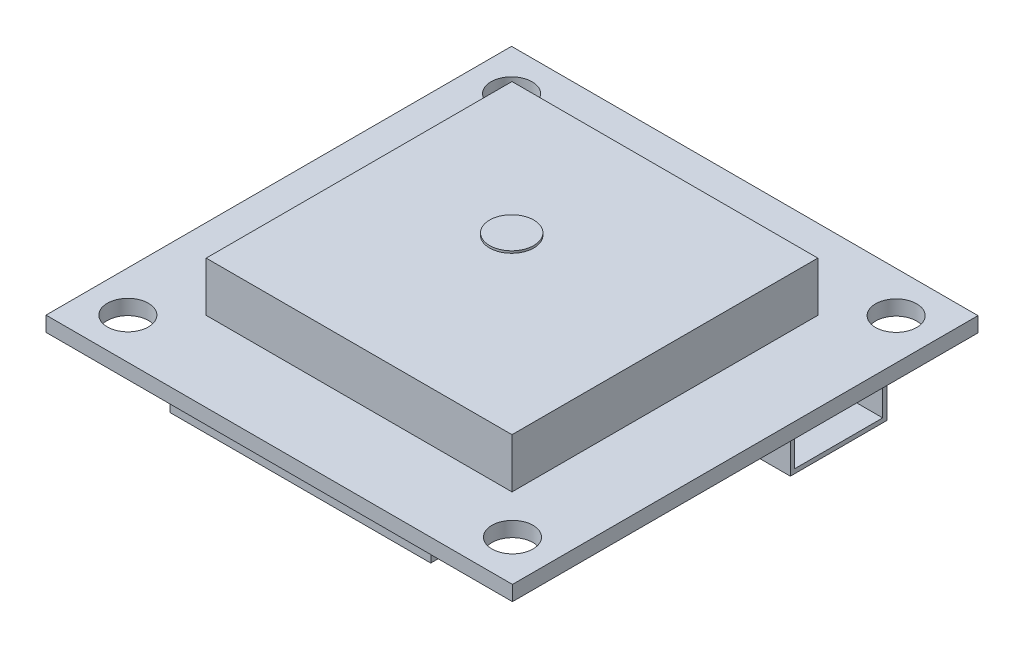
ISO-10303-21;
HEADER;
FILE_DESCRIPTION(('STEP AP214'),'2;1');
FILE_NAME('part.step','',(''),(''),'','','');
FILE_SCHEMA(('AUTOMOTIVE_DESIGN { 1 0 10303 214 1 1 1 1 }'));
ENDSEC;
DATA;
#1=APPLICATION_CONTEXT('core data for automotive mechanical design processes');
#2=APPLICATION_PROTOCOL_DEFINITION('international standard','automotive_design',2000,#1);
#3=PRODUCT_CONTEXT('',#1,'mechanical');
#4=PRODUCT('Part','Part','',(#3));
#5=PRODUCT_RELATED_PRODUCT_CATEGORY('part','',(#4));
#6=PRODUCT_DEFINITION_FORMATION('','',#4);
#7=PRODUCT_DEFINITION_CONTEXT('part definition',#1,'design');
#8=PRODUCT_DEFINITION('design','',#6,#7);
#9=PRODUCT_DEFINITION_SHAPE('','',#8);
#10=(LENGTH_UNIT() NAMED_UNIT(*) SI_UNIT(.MILLI.,.METRE.));
#11=(NAMED_UNIT(*) PLANE_ANGLE_UNIT() SI_UNIT($,.RADIAN.));
#12=(NAMED_UNIT(*) SI_UNIT($,.STERADIAN.) SOLID_ANGLE_UNIT());
#13=UNCERTAINTY_MEASURE_WITH_UNIT(LENGTH_MEASURE(1.E-05),#10,'distance_accuracy_value','');
#14=(GEOMETRIC_REPRESENTATION_CONTEXT(3) GLOBAL_UNCERTAINTY_ASSIGNED_CONTEXT((#13)) GLOBAL_UNIT_ASSIGNED_CONTEXT((#10,
#11,#12)) REPRESENTATION_CONTEXT('',''));
#15=CARTESIAN_POINT('',(0.,0.,0.));
#16=DIRECTION('',(0.,0.,1.));
#17=DIRECTION('',(1.,0.,0.));
#18=AXIS2_PLACEMENT_3D('',#15,#16,#17);
#19=CARTESIAN_POINT('',(0.,5.3086,0.));
#20=DIRECTION('',(0.,-1.,0.));
#21=DIRECTION('',(0.,0.,-1.));
#22=AXIS2_PLACEMENT_3D('',#19,#20,#21);
#23=PLANE('',#22);
#24=DIRECTION('',(0.,0.,-1.));
#25=VECTOR('',#24,1.);
#26=CARTESIAN_POINT('',(31.75,5.3086,-31.7119));
#27=LINE('',#26,#25);
#28=CARTESIAN_POINT('',(31.75,5.3086,-6.5659));
#29=VERTEX_POINT('',#28);
#30=CARTESIAN_POINT('',(31.75,5.3086,-31.7119));
#31=VERTEX_POINT('',#30);
#32=EDGE_CURVE('E275',#29,#31,#27,.T.);
#33=ORIENTED_EDGE('',*,*,#32,.T.);
#34=DIRECTION('',(-1.,0.,0.));
#35=VECTOR('',#34,1.);
#36=CARTESIAN_POINT('',(31.75,5.3086,-31.7119));
#37=LINE('',#36,#35);
#38=CARTESIAN_POINT('',(6.604,5.3086,-31.7119));
#39=VERTEX_POINT('',#38);
#40=EDGE_CURVE('E278',#31,#39,#37,.T.);
#41=ORIENTED_EDGE('',*,*,#40,.T.);
#42=DIRECTION('',(0.,0.,1.));
#43=VECTOR('',#42,1.);
#44=CARTESIAN_POINT('',(6.604,5.3086,-31.7119));
#45=LINE('',#44,#43);
#46=CARTESIAN_POINT('',(6.604,5.3086,-6.56589999999999));
#47=VERTEX_POINT('',#46);
#48=EDGE_CURVE('E281',#39,#47,#45,.T.);
#49=ORIENTED_EDGE('',*,*,#48,.T.);
#50=DIRECTION('',(1.,0.,0.));
#51=VECTOR('',#50,1.);
#52=CARTESIAN_POINT('',(31.75,5.3086,-6.5659));
#53=LINE('',#52,#51);
#54=EDGE_CURVE('E283',#47,#29,#53,.T.);
#55=ORIENTED_EDGE('',*,*,#54,.T.);
#56=EDGE_LOOP('',(#33,#41,#49,#55));
#57=FACE_BOUND('',#56,.T.);
#58=CARTESIAN_POINT('',(17.5387,5.3086,-20.7518));
#59=DIRECTION('',(0.,-1.,0.));
#60=DIRECTION('',(0.,0.,-1.));
#61=AXIS2_PLACEMENT_3D('',#58,#59,#60);
#62=CIRCLE('',#61,1.8161);
#63=CARTESIAN_POINT('',(17.5387,5.3086,-22.5679));
#64=VERTEX_POINT('',#63);
#65=EDGE_CURVE('E11',#64,#64,#62,.F.);
#66=ORIENTED_EDGE('',*,*,#65,.F.);
#67=EDGE_LOOP('',(#66));
#68=FACE_BOUND('',#67,.T.);
#69=ADVANCED_FACE('F32',(#57,#68),#23,.F.);
#70=CARTESIAN_POINT('',(0.,0.,0.));
#71=DIRECTION('',(0.,-1.,0.));
#72=DIRECTION('',(0.,0.,-1.));
#73=AXIS2_PLACEMENT_3D('',#70,#71,#72);
#74=PLANE('',#73);
#75=CARTESIAN_POINT('',(34.9885,0.,-34.9123));
#76=DIRECTION('',(0.,-1.,0.));
#77=DIRECTION('',(0.,0.,-1.));
#78=AXIS2_PLACEMENT_3D('',#75,#76,#77);
#79=CIRCLE('',#78,1.6891);
#80=CARTESIAN_POINT('',(34.9885,0.,-36.6014));
#81=VERTEX_POINT('',#80);
#82=EDGE_CURVE('E502',#81,#81,#79,.F.);
#83=ORIENTED_EDGE('',*,*,#82,.T.);
#84=EDGE_LOOP('',(#83));
#85=FACE_BOUND('',#84,.T.);
#86=CARTESIAN_POINT('',(3.36550000000002,0.,-34.9123));
#87=DIRECTION('',(0.,-1.,0.));
#88=DIRECTION('',(0.,0.,-1.));
#89=AXIS2_PLACEMENT_3D('',#86,#87,#88);
#90=CIRCLE('',#89,1.68909999999999);
#91=CARTESIAN_POINT('',(3.36550000000002,0.,-36.6014));
#92=VERTEX_POINT('',#91);
#93=EDGE_CURVE('E509',#92,#92,#90,.F.);
#94=ORIENTED_EDGE('',*,*,#93,.T.);
#95=EDGE_LOOP('',(#94));
#96=FACE_BOUND('',#95,.T.);
#97=CARTESIAN_POINT('',(3.36550000000002,0.,-3.3655));
#98=DIRECTION('',(0.,-1.,0.));
#99=DIRECTION('',(0.,0.,-1.));
#100=AXIS2_PLACEMENT_3D('',#97,#98,#99);
#101=CIRCLE('',#100,1.6891);
#102=CARTESIAN_POINT('',(3.36550000000002,0.,-5.0546));
#103=VERTEX_POINT('',#102);
#104=EDGE_CURVE('E514',#103,#103,#101,.F.);
#105=ORIENTED_EDGE('',*,*,#104,.T.);
#106=EDGE_LOOP('',(#105));
#107=FACE_BOUND('',#106,.T.);
#108=CARTESIAN_POINT('',(34.9885,0.,-3.3655));
#109=DIRECTION('',(0.,-1.,0.));
#110=DIRECTION('',(0.,0.,-1.));
#111=AXIS2_PLACEMENT_3D('',#108,#109,#110);
#112=CIRCLE('',#111,1.6891);
#113=CARTESIAN_POINT('',(34.9885,0.,-5.0546));
#114=VERTEX_POINT('',#113);
#115=EDGE_CURVE('E196',#114,#114,#112,.F.);
#116=ORIENTED_EDGE('',*,*,#115,.T.);
#117=EDGE_LOOP('',(#116));
#118=FACE_BOUND('',#117,.T.);
#119=CARTESIAN_POINT('',(22.2758,0.,-32.6263));
#120=DIRECTION('',(0.,-1.,0.));
#121=DIRECTION('',(0.,0.,-1.));
#122=AXIS2_PLACEMENT_3D('',#119,#120,#121);
#123=CIRCLE('',#122,3.3782);
#124=CARTESIAN_POINT('',(22.2758,0.,-36.0045));
#125=VERTEX_POINT('',#124);
#126=EDGE_CURVE('E239',#125,#125,#123,.T.);
#127=ORIENTED_EDGE('',*,*,#126,.F.);
#128=EDGE_LOOP('',(#127));
#129=FACE_BOUND('',#128,.T.);
#130=DIRECTION('',(0.,0.,1.));
#131=VECTOR('',#130,1.);
#132=CARTESIAN_POINT('',(0.,0.,0.));
#133=LINE('',#132,#131);
#134=CARTESIAN_POINT('',(0.,0.,-38.2778));
#135=VERTEX_POINT('',#134);
#136=CARTESIAN_POINT('',(0.,0.,0.));
#137=VERTEX_POINT('',#136);
#138=EDGE_CURVE('E307',#135,#137,#133,.T.);
#139=ORIENTED_EDGE('',*,*,#138,.F.);
#140=DIRECTION('',(-1.,0.,0.));
#141=VECTOR('',#140,1.);
#142=CARTESIAN_POINT('',(0.,0.,-38.2778));
#143=LINE('',#142,#141);
#144=CARTESIAN_POINT('',(38.354,0.,-38.2778));
#145=VERTEX_POINT('',#144);
#146=EDGE_CURVE('E312',#145,#135,#143,.T.);
#147=ORIENTED_EDGE('',*,*,#146,.F.);
#148=DIRECTION('',(0.,0.,-1.));
#149=VECTOR('',#148,1.);
#150=CARTESIAN_POINT('',(38.354,0.,0.));
#151=LINE('',#150,#149);
#152=CARTESIAN_POINT('',(38.354,0.,0.));
#153=VERTEX_POINT('',#152);
#154=EDGE_CURVE('E323',#153,#145,#151,.T.);
#155=ORIENTED_EDGE('',*,*,#154,.F.);
#156=DIRECTION('',(1.,0.,0.));
#157=VECTOR('',#156,1.);
#158=CARTESIAN_POINT('',(0.,0.,0.));
#159=LINE('',#158,#157);
#160=EDGE_CURVE('E321',#137,#153,#159,.T.);
#161=ORIENTED_EDGE('',*,*,#160,.F.);
#162=EDGE_LOOP('',(#139,#147,#155,#161));
#163=FACE_BOUND('',#162,.T.);
#164=DIRECTION('',(1.,0.,0.));
#165=VECTOR('',#164,1.);
#166=CARTESIAN_POINT('',(8.382,0.,-18.6055));
#167=LINE('',#166,#165);
#168=CARTESIAN_POINT('',(8.382,0.,-18.6055));
#169=VERTEX_POINT('',#168);
#170=CARTESIAN_POINT('',(29.8196,0.,-18.6055));
#171=VERTEX_POINT('',#170);
#172=EDGE_CURVE('E259',#169,#171,#167,.T.);
#173=ORIENTED_EDGE('',*,*,#172,.F.);
#174=DIRECTION('',(0.,0.,-1.));
#175=VECTOR('',#174,1.);
#176=CARTESIAN_POINT('',(8.382,0.,-1.81609999999999));
#177=LINE('',#176,#175);
#178=CARTESIAN_POINT('',(8.382,0.,-1.81609999999999));
#179=VERTEX_POINT('',#178);
#180=EDGE_CURVE('E243',#179,#169,#177,.T.);
#181=ORIENTED_EDGE('',*,*,#180,.F.);
#182=DIRECTION('',(-1.,0.,0.));
#183=VECTOR('',#182,1.);
#184=CARTESIAN_POINT('',(8.382,0.,-1.81609999999999));
#185=LINE('',#184,#183);
#186=CARTESIAN_POINT('',(29.8196,0.,-1.81609999999999));
#187=VERTEX_POINT('',#186);
#188=EDGE_CURVE('E250',#187,#179,#185,.T.);
#189=ORIENTED_EDGE('',*,*,#188,.F.);
#190=DIRECTION('',(0.,0.,1.));
#191=VECTOR('',#190,1.);
#192=CARTESIAN_POINT('',(29.8196,0.,-1.81609999999999));
#193=LINE('',#192,#191);
#194=EDGE_CURVE('E261',#171,#187,#193,.T.);
#195=ORIENTED_EDGE('',*,*,#194,.F.);
#196=EDGE_LOOP('',(#173,#181,#189,#195));
#197=FACE_BOUND('',#196,.T.);
#198=DIRECTION('',(1.,0.,0.));
#199=VECTOR('',#198,1.);
#200=CARTESIAN_POINT('',(33.528,0.,-31.3055));
#201=LINE('',#200,#199);
#202=CARTESIAN_POINT('',(33.528,0.,-31.3055));
#203=VERTEX_POINT('',#202);
#204=CARTESIAN_POINT('',(37.846,0.,-31.3055));
#205=VERTEX_POINT('',#204);
#206=EDGE_CURVE('E226',#203,#205,#201,.T.);
#207=ORIENTED_EDGE('',*,*,#206,.F.);
#208=DIRECTION('',(0.,0.,-1.));
#209=VECTOR('',#208,1.);
#210=CARTESIAN_POINT('',(33.528,0.,-23.3553));
#211=LINE('',#210,#209);
#212=CARTESIAN_POINT('',(33.528,0.,-23.3553));
#213=VERTEX_POINT('',#212);
#214=EDGE_CURVE('E209',#213,#203,#211,.T.);
#215=ORIENTED_EDGE('',*,*,#214,.F.);
#216=DIRECTION('',(-1.,0.,0.));
#217=VECTOR('',#216,1.);
#218=CARTESIAN_POINT('',(33.528,0.,-23.3553));
#219=LINE('',#218,#217);
#220=CARTESIAN_POINT('',(37.846,0.,-23.3553));
#221=VERTEX_POINT('',#220);
#222=EDGE_CURVE('E217',#221,#213,#219,.T.);
#223=ORIENTED_EDGE('',*,*,#222,.F.);
#224=DIRECTION('',(0.,0.,1.));
#225=VECTOR('',#224,1.);
#226=CARTESIAN_POINT('',(37.846,0.,-23.3553));
#227=LINE('',#226,#225);
#228=EDGE_CURVE('E228',#205,#221,#227,.T.);
#229=ORIENTED_EDGE('',*,*,#228,.F.);
#230=EDGE_LOOP('',(#207,#215,#223,#229));
#231=FACE_BOUND('',#230,.T.);
#232=ADVANCED_FACE('F344',(#85,#96,#107,#118,#129,#163,#197,#231),#74,.T.);
#233=CARTESIAN_POINT('',(0.,1.2319,0.));
#234=DIRECTION('',(0.,-1.,0.));
#235=DIRECTION('',(0.,0.,-1.));
#236=AXIS2_PLACEMENT_3D('',#233,#234,#235);
#237=PLANE('',#236);
#238=CARTESIAN_POINT('',(34.9885,1.2319,-34.9123));
#239=DIRECTION('',(0.,1.,0.));
#240=DIRECTION('',(0.,0.,1.));
#241=AXIS2_PLACEMENT_3D('',#238,#239,#240);
#242=CIRCLE('',#241,1.6891);
#243=CARTESIAN_POINT('',(34.9885,1.2319,-33.2232));
#244=VERTEX_POINT('',#243);
#245=EDGE_CURVE('E505',#244,#244,#242,.T.);
#246=ORIENTED_EDGE('',*,*,#245,.F.);
#247=EDGE_LOOP('',(#246));
#248=FACE_BOUND('',#247,.T.);
#249=CARTESIAN_POINT('',(3.36550000000002,1.2319,-34.9123));
#250=DIRECTION('',(0.,1.,0.));
#251=DIRECTION('',(0.,0.,1.));
#252=AXIS2_PLACEMENT_3D('',#249,#250,#251);
#253=CIRCLE('',#252,1.68909999999999);
#254=CARTESIAN_POINT('',(3.36550000000002,1.2319,-33.2232));
#255=VERTEX_POINT('',#254);
#256=EDGE_CURVE('E511',#255,#255,#253,.T.);
#257=ORIENTED_EDGE('',*,*,#256,.F.);
#258=EDGE_LOOP('',(#257));
#259=FACE_BOUND('',#258,.T.);
#260=CARTESIAN_POINT('',(3.36550000000002,1.2319,-3.3655));
#261=DIRECTION('',(0.,1.,0.));
#262=DIRECTION('',(0.,0.,1.));
#263=AXIS2_PLACEMENT_3D('',#260,#261,#262);
#264=CIRCLE('',#263,1.6891);
#265=CARTESIAN_POINT('',(3.36550000000002,1.2319,-1.6764));
#266=VERTEX_POINT('',#265);
#267=EDGE_CURVE('E517',#266,#266,#264,.T.);
#268=ORIENTED_EDGE('',*,*,#267,.F.);
#269=EDGE_LOOP('',(#268));
#270=FACE_BOUND('',#269,.T.);
#271=CARTESIAN_POINT('',(34.9885,1.2319,-3.3655));
#272=DIRECTION('',(0.,1.,0.));
#273=DIRECTION('',(0.,0.,1.));
#274=AXIS2_PLACEMENT_3D('',#271,#272,#273);
#275=CIRCLE('',#274,1.6891);
#276=CARTESIAN_POINT('',(34.9885,1.2319,-1.6764));
#277=VERTEX_POINT('',#276);
#278=EDGE_CURVE('E203',#277,#277,#275,.T.);
#279=ORIENTED_EDGE('',*,*,#278,.F.);
#280=EDGE_LOOP('',(#279));
#281=FACE_BOUND('',#280,.T.);
#282=DIRECTION('',(0.,0.,1.));
#283=VECTOR('',#282,1.);
#284=CARTESIAN_POINT('',(0.,1.2319,0.));
#285=LINE('',#284,#283);
#286=CARTESIAN_POINT('',(0.,1.2319,-38.2778));
#287=VERTEX_POINT('',#286);
#288=CARTESIAN_POINT('',(0.,1.2319,0.));
#289=VERTEX_POINT('',#288);
#290=EDGE_CURVE('E308',#287,#289,#285,.T.);
#291=ORIENTED_EDGE('',*,*,#290,.T.);
#292=DIRECTION('',(1.,0.,0.));
#293=VECTOR('',#292,1.);
#294=CARTESIAN_POINT('',(0.,1.2319,0.));
#295=LINE('',#294,#293);
#296=CARTESIAN_POINT('',(38.354,1.2319,0.));
#297=VERTEX_POINT('',#296);
#298=EDGE_CURVE('E311',#289,#297,#295,.T.);
#299=ORIENTED_EDGE('',*,*,#298,.T.);
#300=DIRECTION('',(0.,0.,-1.));
#301=VECTOR('',#300,1.);
#302=CARTESIAN_POINT('',(38.354,1.2319,0.));
#303=LINE('',#302,#301);
#304=CARTESIAN_POINT('',(38.354,1.2319,-38.2778));
#305=VERTEX_POINT('',#304);
#306=EDGE_CURVE('E314',#297,#305,#303,.T.);
#307=ORIENTED_EDGE('',*,*,#306,.T.);
#308=DIRECTION('',(-1.,0.,0.));
#309=VECTOR('',#308,1.);
#310=CARTESIAN_POINT('',(0.,1.2319,-38.2778));
#311=LINE('',#310,#309);
#312=EDGE_CURVE('E316',#305,#287,#311,.T.);
#313=ORIENTED_EDGE('',*,*,#312,.T.);
#314=EDGE_LOOP('',(#291,#299,#307,#313));
#315=FACE_BOUND('',#314,.T.);
#316=DIRECTION('',(0.,0.,-1.));
#317=VECTOR('',#316,1.);
#318=CARTESIAN_POINT('',(31.75,1.2319,-31.7119));
#319=LINE('',#318,#317);
#320=CARTESIAN_POINT('',(31.75,1.2319,-6.5659));
#321=VERTEX_POINT('',#320);
#322=CARTESIAN_POINT('',(31.75,1.2319,-31.7119));
#323=VERTEX_POINT('',#322);
#324=EDGE_CURVE('E274',#321,#323,#319,.T.);
#325=ORIENTED_EDGE('',*,*,#324,.F.);
#326=DIRECTION('',(1.,0.,0.));
#327=VECTOR('',#326,1.);
#328=CARTESIAN_POINT('',(31.75,1.2319,-6.5659));
#329=LINE('',#328,#327);
#330=CARTESIAN_POINT('',(6.604,1.2319,-6.56589999999999));
#331=VERTEX_POINT('',#330);
#332=EDGE_CURVE('E279',#331,#321,#329,.T.);
#333=ORIENTED_EDGE('',*,*,#332,.F.);
#334=DIRECTION('',(0.,0.,1.));
#335=VECTOR('',#334,1.);
#336=CARTESIAN_POINT('',(6.604,1.2319,-31.7119));
#337=LINE('',#336,#335);
#338=CARTESIAN_POINT('',(6.604,1.2319,-31.7119));
#339=VERTEX_POINT('',#338);
#340=EDGE_CURVE('E291',#339,#331,#337,.T.);
#341=ORIENTED_EDGE('',*,*,#340,.F.);
#342=DIRECTION('',(-1.,0.,0.));
#343=VECTOR('',#342,1.);
#344=CARTESIAN_POINT('',(31.75,1.2319,-31.7119));
#345=LINE('',#344,#343);
#346=EDGE_CURVE('E288',#323,#339,#345,.T.);
#347=ORIENTED_EDGE('',*,*,#346,.F.);
#348=EDGE_LOOP('',(#325,#333,#341,#347));
#349=FACE_BOUND('',#348,.T.);
#350=ADVANCED_FACE('F355',(#248,#259,#270,#281,#315,#349),#237,.F.);
#351=CARTESIAN_POINT('',(0.,1.2319,0.));
#352=DIRECTION('',(1.,0.,0.));
#353=DIRECTION('',(0.,0.,-1.));
#354=AXIS2_PLACEMENT_3D('',#351,#352,#353);
#355=PLANE('',#354);
#356=ORIENTED_EDGE('',*,*,#138,.T.);
#357=DIRECTION('',(0.,-1.,0.));
#358=VECTOR('',#357,1.);
#359=CARTESIAN_POINT('',(0.,1.2319,0.));
#360=LINE('',#359,#358);
#361=EDGE_CURVE('E40',#289,#137,#360,.T.);
#362=ORIENTED_EDGE('',*,*,#361,.F.);
#363=ORIENTED_EDGE('',*,*,#290,.F.);
#364=DIRECTION('',(0.,-1.,0.));
#365=VECTOR('',#364,1.);
#366=CARTESIAN_POINT('',(0.,1.2319,-38.2778));
#367=LINE('',#366,#365);
#368=EDGE_CURVE('E318',#287,#135,#367,.T.);
#369=ORIENTED_EDGE('',*,*,#368,.T.);
#370=EDGE_LOOP('',(#356,#362,#363,#369));
#371=FACE_BOUND('',#370,.T.);
#372=ADVANCED_FACE('F34',(#371),#355,.F.);
#373=CARTESIAN_POINT('',(0.,1.2319,0.));
#374=DIRECTION('',(0.,0.,-1.));
#375=DIRECTION('',(-1.,0.,0.));
#376=AXIS2_PLACEMENT_3D('',#373,#374,#375);
#377=PLANE('',#376);
#378=ORIENTED_EDGE('',*,*,#160,.T.);
#379=DIRECTION('',(0.,-1.,0.));
#380=VECTOR('',#379,1.);
#381=CARTESIAN_POINT('',(38.354,1.2319,0.));
#382=LINE('',#381,#380);
#383=EDGE_CURVE('E331',#297,#153,#382,.T.);
#384=ORIENTED_EDGE('',*,*,#383,.F.);
#385=ORIENTED_EDGE('',*,*,#298,.F.);
#386=ORIENTED_EDGE('',*,*,#361,.T.);
#387=EDGE_LOOP('',(#378,#384,#385,#386));
#388=FACE_BOUND('',#387,.T.);
#389=ADVANCED_FACE('F336',(#388),#377,.F.);
#390=CARTESIAN_POINT('',(38.354,1.2319,0.));
#391=DIRECTION('',(-1.,0.,0.));
#392=DIRECTION('',(0.,0.,1.));
#393=AXIS2_PLACEMENT_3D('',#390,#391,#392);
#394=PLANE('',#393);
#395=ORIENTED_EDGE('',*,*,#154,.T.);
#396=DIRECTION('',(0.,-1.,0.));
#397=VECTOR('',#396,1.);
#398=CARTESIAN_POINT('',(38.354,1.2319,-38.2778));
#399=LINE('',#398,#397);
#400=EDGE_CURVE('E328',#305,#145,#399,.T.);
#401=ORIENTED_EDGE('',*,*,#400,.F.);
#402=ORIENTED_EDGE('',*,*,#306,.F.);
#403=ORIENTED_EDGE('',*,*,#383,.T.);
#404=EDGE_LOOP('',(#395,#401,#402,#403));
#405=FACE_BOUND('',#404,.T.);
#406=ADVANCED_FACE('F349',(#405),#394,.F.);
#407=CARTESIAN_POINT('',(0.,1.2319,-38.2778));
#408=DIRECTION('',(0.,0.,1.));
#409=DIRECTION('',(1.,0.,0.));
#410=AXIS2_PLACEMENT_3D('',#407,#408,#409);
#411=PLANE('',#410);
#412=ORIENTED_EDGE('',*,*,#146,.T.);
#413=ORIENTED_EDGE('',*,*,#368,.F.);
#414=ORIENTED_EDGE('',*,*,#312,.F.);
#415=ORIENTED_EDGE('',*,*,#400,.T.);
#416=EDGE_LOOP('',(#412,#413,#414,#415));
#417=FACE_BOUND('',#416,.T.);
#418=ADVANCED_FACE('F353',(#417),#411,.F.);
#419=CARTESIAN_POINT('',(31.75,5.3086,-31.7119));
#420=DIRECTION('',(-1.,0.,0.));
#421=DIRECTION('',(0.,0.,1.));
#422=AXIS2_PLACEMENT_3D('',#419,#420,#421);
#423=PLANE('',#422);
#424=ORIENTED_EDGE('',*,*,#324,.T.);
#425=DIRECTION('',(0.,-1.,0.));
#426=VECTOR('',#425,1.);
#427=CARTESIAN_POINT('',(31.75,5.3086,-31.7119));
#428=LINE('',#427,#426);
#429=EDGE_CURVE('E304',#31,#323,#428,.T.);
#430=ORIENTED_EDGE('',*,*,#429,.F.);
#431=ORIENTED_EDGE('',*,*,#32,.F.);
#432=DIRECTION('',(0.,-1.,0.));
#433=VECTOR('',#432,1.);
#434=CARTESIAN_POINT('',(31.75,5.3086,-6.5659));
#435=LINE('',#434,#433);
#436=EDGE_CURVE('E285',#29,#321,#435,.T.);
#437=ORIENTED_EDGE('',*,*,#436,.T.);
#438=EDGE_LOOP('',(#424,#430,#431,#437));
#439=FACE_BOUND('',#438,.T.);
#440=ADVANCED_FACE('F368',(#439),#423,.F.);
#441=CARTESIAN_POINT('',(31.75,5.3086,-31.7119));
#442=DIRECTION('',(0.,0.,1.));
#443=DIRECTION('',(1.,0.,0.));
#444=AXIS2_PLACEMENT_3D('',#441,#442,#443);
#445=PLANE('',#444);
#446=ORIENTED_EDGE('',*,*,#346,.T.);
#447=DIRECTION('',(0.,-1.,0.));
#448=VECTOR('',#447,1.);
#449=CARTESIAN_POINT('',(6.604,5.3086,-31.7119));
#450=LINE('',#449,#448);
#451=EDGE_CURVE('E301',#39,#339,#450,.T.);
#452=ORIENTED_EDGE('',*,*,#451,.F.);
#453=ORIENTED_EDGE('',*,*,#40,.F.);
#454=ORIENTED_EDGE('',*,*,#429,.T.);
#455=EDGE_LOOP('',(#446,#452,#453,#454));
#456=FACE_BOUND('',#455,.T.);
#457=ADVANCED_FACE('F376',(#456),#445,.F.);
#458=CARTESIAN_POINT('',(6.604,5.3086,-31.7119));
#459=DIRECTION('',(1.,0.,0.));
#460=DIRECTION('',(0.,0.,-1.));
#461=AXIS2_PLACEMENT_3D('',#458,#459,#460);
#462=PLANE('',#461);
#463=ORIENTED_EDGE('',*,*,#340,.T.);
#464=DIRECTION('',(0.,-1.,0.));
#465=VECTOR('',#464,1.);
#466=CARTESIAN_POINT('',(6.604,5.3086,-6.56589999999999));
#467=LINE('',#466,#465);
#468=EDGE_CURVE('E298',#47,#331,#467,.T.);
#469=ORIENTED_EDGE('',*,*,#468,.F.);
#470=ORIENTED_EDGE('',*,*,#48,.F.);
#471=ORIENTED_EDGE('',*,*,#451,.T.);
#472=EDGE_LOOP('',(#463,#469,#470,#471));
#473=FACE_BOUND('',#472,.T.);
#474=ADVANCED_FACE('F374',(#473),#462,.F.);
#475=CARTESIAN_POINT('',(31.75,5.3086,-6.5659));
#476=DIRECTION('',(0.,0.,-1.));
#477=DIRECTION('',(-1.,0.,0.));
#478=AXIS2_PLACEMENT_3D('',#475,#476,#477);
#479=PLANE('',#478);
#480=ORIENTED_EDGE('',*,*,#332,.T.);
#481=ORIENTED_EDGE('',*,*,#436,.F.);
#482=ORIENTED_EDGE('',*,*,#54,.F.);
#483=ORIENTED_EDGE('',*,*,#468,.T.);
#484=EDGE_LOOP('',(#480,#481,#482,#483));
#485=FACE_BOUND('',#484,.T.);
#486=ADVANCED_FACE('F364',(#485),#479,.F.);
#487=CARTESIAN_POINT('',(8.382,-2.4257,-1.81609999999999));
#488=DIRECTION('',(1.,0.,0.));
#489=DIRECTION('',(0.,0.,-1.));
#490=AXIS2_PLACEMENT_3D('',#487,#488,#489);
#491=PLANE('',#490);
#492=ORIENTED_EDGE('',*,*,#180,.T.);
#493=DIRECTION('',(0.,1.,0.));
#494=VECTOR('',#493,1.);
#495=CARTESIAN_POINT('',(8.382,-2.4257,-18.6055));
#496=LINE('',#495,#494);
#497=CARTESIAN_POINT('',(8.382,-2.4257,-18.6055));
#498=VERTEX_POINT('',#497);
#499=EDGE_CURVE('E272',#498,#169,#496,.T.);
#500=ORIENTED_EDGE('',*,*,#499,.F.);
#501=DIRECTION('',(0.,0.,-1.));
#502=VECTOR('',#501,1.);
#503=CARTESIAN_POINT('',(8.382,-2.4257,-1.81609999999999));
#504=LINE('',#503,#502);
#505=CARTESIAN_POINT('',(8.382,-2.4257,-1.81609999999999));
#506=VERTEX_POINT('',#505);
#507=EDGE_CURVE('E246',#506,#498,#504,.T.);
#508=ORIENTED_EDGE('',*,*,#507,.F.);
#509=DIRECTION('',(0.,1.,0.));
#510=VECTOR('',#509,1.);
#511=CARTESIAN_POINT('',(8.382,-2.4257,-1.81609999999999));
#512=LINE('',#511,#510);
#513=EDGE_CURVE('E256',#506,#179,#512,.T.);
#514=ORIENTED_EDGE('',*,*,#513,.T.);
#515=EDGE_LOOP('',(#492,#500,#508,#514));
#516=FACE_BOUND('',#515,.T.);
#517=ADVANCED_FACE('F394',(#516),#491,.F.);
#518=CARTESIAN_POINT('',(8.382,-2.4257,-18.6055));
#519=DIRECTION('',(0.,0.,1.));
#520=DIRECTION('',(1.,0.,0.));
#521=AXIS2_PLACEMENT_3D('',#518,#519,#520);
#522=PLANE('',#521);
#523=ORIENTED_EDGE('',*,*,#172,.T.);
#524=DIRECTION('',(0.,1.,0.));
#525=VECTOR('',#524,1.);
#526=CARTESIAN_POINT('',(29.8196,-2.4257,-18.6055));
#527=LINE('',#526,#525);
#528=CARTESIAN_POINT('',(29.8196,-2.4257,-18.6055));
#529=VERTEX_POINT('',#528);
#530=EDGE_CURVE('E269',#529,#171,#527,.T.);
#531=ORIENTED_EDGE('',*,*,#530,.F.);
#532=DIRECTION('',(1.,0.,0.));
#533=VECTOR('',#532,1.);
#534=CARTESIAN_POINT('',(8.382,-2.4257,-18.6055));
#535=LINE('',#534,#533);
#536=EDGE_CURVE('E249',#498,#529,#535,.T.);
#537=ORIENTED_EDGE('',*,*,#536,.F.);
#538=ORIENTED_EDGE('',*,*,#499,.T.);
#539=EDGE_LOOP('',(#523,#531,#537,#538));
#540=FACE_BOUND('',#539,.T.);
#541=ADVANCED_FACE('F400',(#540),#522,.F.);
#542=CARTESIAN_POINT('',(29.8196,-2.4257,-1.81609999999999));
#543=DIRECTION('',(-1.,0.,0.));
#544=DIRECTION('',(0.,0.,1.));
#545=AXIS2_PLACEMENT_3D('',#542,#543,#544);
#546=PLANE('',#545);
#547=ORIENTED_EDGE('',*,*,#194,.T.);
#548=DIRECTION('',(0.,1.,0.));
#549=VECTOR('',#548,1.);
#550=CARTESIAN_POINT('',(29.8196,-2.4257,-1.81609999999999));
#551=LINE('',#550,#549);
#552=CARTESIAN_POINT('',(29.8196,-2.4257,-1.81609999999999));
#553=VERTEX_POINT('',#552);
#554=EDGE_CURVE('E267',#553,#187,#551,.T.);
#555=ORIENTED_EDGE('',*,*,#554,.F.);
#556=DIRECTION('',(0.,0.,1.));
#557=VECTOR('',#556,1.);
#558=CARTESIAN_POINT('',(29.8196,-2.4257,-1.81609999999999));
#559=LINE('',#558,#557);
#560=EDGE_CURVE('E252',#529,#553,#559,.T.);
#561=ORIENTED_EDGE('',*,*,#560,.F.);
#562=ORIENTED_EDGE('',*,*,#530,.T.);
#563=EDGE_LOOP('',(#547,#555,#561,#562));
#564=FACE_BOUND('',#563,.T.);
#565=ADVANCED_FACE('F405',(#564),#546,.F.);
#566=CARTESIAN_POINT('',(8.382,-2.4257,-1.81609999999999));
#567=DIRECTION('',(0.,0.,-1.));
#568=DIRECTION('',(-1.,0.,0.));
#569=AXIS2_PLACEMENT_3D('',#566,#567,#568);
#570=PLANE('',#569);
#571=ORIENTED_EDGE('',*,*,#188,.T.);
#572=ORIENTED_EDGE('',*,*,#513,.F.);
#573=DIRECTION('',(-1.,0.,0.));
#574=VECTOR('',#573,1.);
#575=CARTESIAN_POINT('',(8.382,-2.4257,-1.81609999999999));
#576=LINE('',#575,#574);
#577=EDGE_CURVE('E254',#553,#506,#576,.T.);
#578=ORIENTED_EDGE('',*,*,#577,.F.);
#579=ORIENTED_EDGE('',*,*,#554,.T.);
#580=EDGE_LOOP('',(#571,#572,#578,#579));
#581=FACE_BOUND('',#580,.T.);
#582=ADVANCED_FACE('F423',(#581),#570,.F.);
#583=CARTESIAN_POINT('',(0.,-2.4257,0.));
#584=DIRECTION('',(0.,-1.,0.));
#585=DIRECTION('',(0.,0.,-1.));
#586=AXIS2_PLACEMENT_3D('',#583,#584,#585);
#587=PLANE('',#586);
#588=ORIENTED_EDGE('',*,*,#507,.T.);
#589=ORIENTED_EDGE('',*,*,#536,.T.);
#590=ORIENTED_EDGE('',*,*,#560,.T.);
#591=ORIENTED_EDGE('',*,*,#577,.T.);
#592=EDGE_LOOP('',(#588,#589,#590,#591));
#593=FACE_BOUND('',#592,.T.);
#594=ADVANCED_FACE('F421',(#593),#587,.T.);
#595=CARTESIAN_POINT('',(22.2758,-2.1082,-32.6263));
#596=DIRECTION('',(0.,1.,0.));
#597=DIRECTION('',(0.,0.,1.));
#598=AXIS2_PLACEMENT_3D('',#595,#596,#597);
#599=CYLINDRICAL_SURFACE('',#598,3.3782);
#600=CARTESIAN_POINT('',(22.2758,-2.1082,-32.6263));
#601=DIRECTION('',(0.,-1.,0.));
#602=DIRECTION('',(0.,0.,-1.));
#603=AXIS2_PLACEMENT_3D('',#600,#601,#602);
#604=CIRCLE('',#603,3.3782);
#605=CARTESIAN_POINT('',(22.2758,-2.1082,-36.0045));
#606=VERTEX_POINT('',#605);
#607=EDGE_CURVE('E240',#606,#606,#604,.T.);
#608=ORIENTED_EDGE('',*,*,#607,.F.);
#609=EDGE_LOOP('',(#608));
#610=FACE_BOUND('',#609,.T.);
#611=ORIENTED_EDGE('',*,*,#126,.T.);
#612=EDGE_LOOP('',(#611));
#613=FACE_BOUND('',#612,.T.);
#614=ADVANCED_FACE('F430',(#610,#613),#599,.T.);
#615=CARTESIAN_POINT('',(22.2758,-2.1082,-32.6263));
#616=DIRECTION('',(0.,-1.,0.));
#617=DIRECTION('',(0.,0.,-1.));
#618=AXIS2_PLACEMENT_3D('',#615,#616,#617);
#619=PLANE('',#618);
#620=ORIENTED_EDGE('',*,*,#607,.T.);
#621=EDGE_LOOP('',(#620));
#622=FACE_BOUND('',#621,.T.);
#623=ADVANCED_FACE('F436',(#622),#619,.T.);
#624=CARTESIAN_POINT('',(33.528,-2.9972,-23.3553));
#625=DIRECTION('',(1.,0.,0.));
#626=DIRECTION('',(0.,0.,-1.));
#627=AXIS2_PLACEMENT_3D('',#624,#625,#626);
#628=PLANE('',#627);
#629=ORIENTED_EDGE('',*,*,#214,.T.);
#630=DIRECTION('',(0.,1.,0.));
#631=VECTOR('',#630,1.);
#632=CARTESIAN_POINT('',(33.528,-2.9972,-31.3055));
#633=LINE('',#632,#631);
#634=CARTESIAN_POINT('',(33.528,-2.9972,-31.3055));
#635=VERTEX_POINT('',#634);
#636=EDGE_CURVE('E237',#635,#203,#633,.T.);
#637=ORIENTED_EDGE('',*,*,#636,.F.);
#638=DIRECTION('',(0.,0.,-1.));
#639=VECTOR('',#638,1.);
#640=CARTESIAN_POINT('',(33.528,-2.9972,-23.3553));
#641=LINE('',#640,#639);
#642=CARTESIAN_POINT('',(33.528,-2.9972,-23.3553));
#643=VERTEX_POINT('',#642);
#644=EDGE_CURVE('E213',#643,#635,#641,.T.);
#645=ORIENTED_EDGE('',*,*,#644,.F.);
#646=DIRECTION('',(0.,1.,0.));
#647=VECTOR('',#646,1.);
#648=CARTESIAN_POINT('',(33.528,-2.9972,-23.3553));
#649=LINE('',#648,#647);
#650=EDGE_CURVE('E223',#643,#213,#649,.T.);
#651=ORIENTED_EDGE('',*,*,#650,.T.);
#652=EDGE_LOOP('',(#629,#637,#645,#651));
#653=FACE_BOUND('',#652,.T.);
#654=ADVANCED_FACE('F440',(#653),#628,.F.);
#655=CARTESIAN_POINT('',(33.528,-2.9972,-31.3055));
#656=DIRECTION('',(0.,0.,1.));
#657=DIRECTION('',(1.,0.,0.));
#658=AXIS2_PLACEMENT_3D('',#655,#656,#657);
#659=PLANE('',#658);
#660=ORIENTED_EDGE('',*,*,#206,.T.);
#661=DIRECTION('',(0.,1.,0.));
#662=VECTOR('',#661,1.);
#663=CARTESIAN_POINT('',(37.846,-2.9972,-31.3055));
#664=LINE('',#663,#662);
#665=CARTESIAN_POINT('',(37.846,-2.9972,-31.3055));
#666=VERTEX_POINT('',#665);
#667=EDGE_CURVE('E234',#666,#205,#664,.T.);
#668=ORIENTED_EDGE('',*,*,#667,.F.);
#669=DIRECTION('',(1.,0.,0.));
#670=VECTOR('',#669,1.);
#671=CARTESIAN_POINT('',(33.528,-2.9972,-31.3055));
#672=LINE('',#671,#670);
#673=EDGE_CURVE('E216',#635,#666,#672,.T.);
#674=ORIENTED_EDGE('',*,*,#673,.F.);
#675=ORIENTED_EDGE('',*,*,#636,.T.);
#676=EDGE_LOOP('',(#660,#668,#674,#675));
#677=FACE_BOUND('',#676,.T.);
#678=ADVANCED_FACE('F444',(#677),#659,.F.);
#679=CARTESIAN_POINT('',(37.846,-2.9972,-23.3553));
#680=DIRECTION('',(-1.,0.,0.));
#681=DIRECTION('',(0.,0.,1.));
#682=AXIS2_PLACEMENT_3D('',#679,#680,#681);
#683=PLANE('',#682);
#684=DIRECTION('',(0.,0.,-1.));
#685=VECTOR('',#684,1.);
#686=CARTESIAN_POINT('',(37.846,-2.6416,-23.7109));
#687=LINE('',#686,#685);
#688=CARTESIAN_POINT('',(37.846,-2.6416,-23.7109));
#689=VERTEX_POINT('',#688);
#690=CARTESIAN_POINT('',(37.846,-2.6416,-30.9499));
#691=VERTEX_POINT('',#690);
#692=EDGE_CURVE('E202',#689,#691,#687,.T.);
#693=ORIENTED_EDGE('',*,*,#692,.F.);
#694=DIRECTION('',(0.,-1.,0.));
#695=VECTOR('',#694,1.);
#696=CARTESIAN_POINT('',(37.846,-0.3556,-23.7109));
#697=LINE('',#696,#695);
#698=CARTESIAN_POINT('',(37.846,-0.3556,-23.7109));
#699=VERTEX_POINT('',#698);
#700=EDGE_CURVE('E47',#699,#689,#697,.T.);
#701=ORIENTED_EDGE('',*,*,#700,.F.);
#702=DIRECTION('',(0.,0.,1.));
#703=VECTOR('',#702,1.);
#704=CARTESIAN_POINT('',(37.846,-0.3556,-23.7109));
#705=LINE('',#704,#703);
#706=CARTESIAN_POINT('',(37.846,-0.3556,-30.9499));
#707=VERTEX_POINT('',#706);
#708=EDGE_CURVE('E190',#707,#699,#705,.T.);
#709=ORIENTED_EDGE('',*,*,#708,.F.);
#710=DIRECTION('',(0.,1.,0.));
#711=VECTOR('',#710,1.);
#712=CARTESIAN_POINT('',(37.846,-0.3556,-30.9499));
#713=LINE('',#712,#711);
#714=EDGE_CURVE('E193',#691,#707,#713,.T.);
#715=ORIENTED_EDGE('',*,*,#714,.F.);
#716=EDGE_LOOP('',(#693,#701,#709,#715));
#717=FACE_BOUND('',#716,.T.);
#718=ORIENTED_EDGE('',*,*,#228,.T.);
#719=DIRECTION('',(0.,1.,0.));
#720=VECTOR('',#719,1.);
#721=CARTESIAN_POINT('',(37.846,-2.9972,-23.3553));
#722=LINE('',#721,#720);
#723=CARTESIAN_POINT('',(37.846,-2.9972,-23.3553));
#724=VERTEX_POINT('',#723);
#725=EDGE_CURVE('E55',#724,#221,#722,.T.);
#726=ORIENTED_EDGE('',*,*,#725,.F.);
#727=DIRECTION('',(0.,0.,1.));
#728=VECTOR('',#727,1.);
#729=CARTESIAN_POINT('',(37.846,-2.9972,-23.3553));
#730=LINE('',#729,#728);
#731=EDGE_CURVE('E219',#666,#724,#730,.T.);
#732=ORIENTED_EDGE('',*,*,#731,.F.);
#733=ORIENTED_EDGE('',*,*,#667,.T.);
#734=EDGE_LOOP('',(#718,#726,#732,#733));
#735=FACE_BOUND('',#734,.T.);
#736=ADVANCED_FACE('F448',(#717,#735),#683,.F.);
#737=CARTESIAN_POINT('',(33.528,-2.9972,-23.3553));
#738=DIRECTION('',(0.,0.,-1.));
#739=DIRECTION('',(-1.,0.,0.));
#740=AXIS2_PLACEMENT_3D('',#737,#738,#739);
#741=PLANE('',#740);
#742=ORIENTED_EDGE('',*,*,#222,.T.);
#743=ORIENTED_EDGE('',*,*,#650,.F.);
#744=DIRECTION('',(-1.,0.,0.));
#745=VECTOR('',#744,1.);
#746=CARTESIAN_POINT('',(33.528,-2.9972,-23.3553));
#747=LINE('',#746,#745);
#748=EDGE_CURVE('E221',#724,#643,#747,.T.);
#749=ORIENTED_EDGE('',*,*,#748,.F.);
#750=ORIENTED_EDGE('',*,*,#725,.T.);
#751=EDGE_LOOP('',(#742,#743,#749,#750));
#752=FACE_BOUND('',#751,.T.);
#753=ADVANCED_FACE('F452',(#752),#741,.F.);
#754=CARTESIAN_POINT('',(0.,-2.9972,0.));
#755=DIRECTION('',(0.,-1.,0.));
#756=DIRECTION('',(0.,0.,-1.));
#757=AXIS2_PLACEMENT_3D('',#754,#755,#756);
#758=PLANE('',#757);
#759=ORIENTED_EDGE('',*,*,#644,.T.);
#760=ORIENTED_EDGE('',*,*,#673,.T.);
#761=ORIENTED_EDGE('',*,*,#731,.T.);
#762=ORIENTED_EDGE('',*,*,#748,.T.);
#763=EDGE_LOOP('',(#759,#760,#761,#762));
#764=FACE_BOUND('',#763,.T.);
#765=ADVANCED_FACE('F456',(#764),#758,.T.);
#766=CARTESIAN_POINT('',(34.0868,-0.3556,-23.7109));
#767=DIRECTION('',(0.,0.,1.));
#768=DIRECTION('',(1.,0.,0.));
#769=AXIS2_PLACEMENT_3D('',#766,#767,#768);
#770=PLANE('',#769);
#771=ORIENTED_EDGE('',*,*,#700,.T.);
#772=DIRECTION('',(1.,0.,0.));
#773=VECTOR('',#772,1.);
#774=CARTESIAN_POINT('',(34.0868,-2.6416,-23.7109));
#775=LINE('',#774,#773);
#776=CARTESIAN_POINT('',(34.0868,-2.6416,-23.7109));
#777=VERTEX_POINT('',#776);
#778=EDGE_CURVE('E168',#777,#689,#775,.T.);
#779=ORIENTED_EDGE('',*,*,#778,.F.);
#780=DIRECTION('',(0.,-1.,0.));
#781=VECTOR('',#780,1.);
#782=CARTESIAN_POINT('',(34.0868,-0.3556,-23.7109));
#783=LINE('',#782,#781);
#784=CARTESIAN_POINT('',(34.0868,-0.3556,-23.7109));
#785=VERTEX_POINT('',#784);
#786=EDGE_CURVE('E172',#785,#777,#783,.T.);
#787=ORIENTED_EDGE('',*,*,#786,.F.);
#788=DIRECTION('',(1.,0.,0.));
#789=VECTOR('',#788,1.);
#790=CARTESIAN_POINT('',(34.0868,-0.3556,-23.7109));
#791=LINE('',#790,#789);
#792=EDGE_CURVE('E207',#785,#699,#791,.T.);
#793=ORIENTED_EDGE('',*,*,#792,.T.);
#794=EDGE_LOOP('',(#771,#779,#787,#793));
#795=FACE_BOUND('',#794,.T.);
#796=ADVANCED_FACE('F170',(#795),#770,.F.);
#797=CARTESIAN_POINT('',(34.0868,-0.3556,-23.7109));
#798=DIRECTION('',(0.,1.,0.));
#799=DIRECTION('',(0.,0.,1.));
#800=AXIS2_PLACEMENT_3D('',#797,#798,#799);
#801=PLANE('',#800);
#802=ORIENTED_EDGE('',*,*,#708,.T.);
#803=ORIENTED_EDGE('',*,*,#792,.F.);
#804=DIRECTION('',(0.,0.,1.));
#805=VECTOR('',#804,1.);
#806=CARTESIAN_POINT('',(34.0868,-0.3556,-23.7109));
#807=LINE('',#806,#805);
#808=CARTESIAN_POINT('',(34.0868,-0.3556,-30.9499));
#809=VERTEX_POINT('',#808);
#810=EDGE_CURVE('E178',#809,#785,#807,.T.);
#811=ORIENTED_EDGE('',*,*,#810,.F.);
#812=DIRECTION('',(1.,0.,0.));
#813=VECTOR('',#812,1.);
#814=CARTESIAN_POINT('',(34.0868,-0.3556,-30.9499));
#815=LINE('',#814,#813);
#816=EDGE_CURVE('E210',#809,#707,#815,.T.);
#817=ORIENTED_EDGE('',*,*,#816,.T.);
#818=EDGE_LOOP('',(#802,#803,#811,#817));
#819=FACE_BOUND('',#818,.T.);
#820=ADVANCED_FACE('F462',(#819),#801,.F.);
#821=CARTESIAN_POINT('',(34.0868,-0.3556,-30.9499));
#822=DIRECTION('',(0.,0.,-1.));
#823=DIRECTION('',(-1.,0.,0.));
#824=AXIS2_PLACEMENT_3D('',#821,#822,#823);
#825=PLANE('',#824);
#826=ORIENTED_EDGE('',*,*,#714,.T.);
#827=ORIENTED_EDGE('',*,*,#816,.F.);
#828=DIRECTION('',(0.,1.,0.));
#829=VECTOR('',#828,1.);
#830=CARTESIAN_POINT('',(34.0868,-0.3556,-30.9499));
#831=LINE('',#830,#829);
#832=CARTESIAN_POINT('',(34.0868,-2.6416,-30.9499));
#833=VERTEX_POINT('',#832);
#834=EDGE_CURVE('E186',#833,#809,#831,.T.);
#835=ORIENTED_EDGE('',*,*,#834,.F.);
#836=DIRECTION('',(1.,0.,0.));
#837=VECTOR('',#836,1.);
#838=CARTESIAN_POINT('',(34.0868,-2.6416,-30.9499));
#839=LINE('',#838,#837);
#840=EDGE_CURVE('E177',#833,#691,#839,.T.);
#841=ORIENTED_EDGE('',*,*,#840,.T.);
#842=EDGE_LOOP('',(#826,#827,#835,#841));
#843=FACE_BOUND('',#842,.T.);
#844=ADVANCED_FACE('F465',(#843),#825,.F.);
#845=CARTESIAN_POINT('',(34.0868,-2.6416,-23.7109));
#846=DIRECTION('',(0.,-1.,0.));
#847=DIRECTION('',(0.,0.,-1.));
#848=AXIS2_PLACEMENT_3D('',#845,#846,#847);
#849=PLANE('',#848);
#850=ORIENTED_EDGE('',*,*,#692,.T.);
#851=ORIENTED_EDGE('',*,*,#840,.F.);
#852=DIRECTION('',(0.,0.,-1.));
#853=VECTOR('',#852,1.);
#854=CARTESIAN_POINT('',(34.0868,-2.6416,-23.7109));
#855=LINE('',#854,#853);
#856=EDGE_CURVE('E181',#777,#833,#855,.T.);
#857=ORIENTED_EDGE('',*,*,#856,.F.);
#858=ORIENTED_EDGE('',*,*,#778,.T.);
#859=EDGE_LOOP('',(#850,#851,#857,#858));
#860=FACE_BOUND('',#859,.T.);
#861=ADVANCED_FACE('F182',(#860),#849,.F.);
#862=CARTESIAN_POINT('',(34.0868,0.,0.));
#863=DIRECTION('',(1.,0.,0.));
#864=DIRECTION('',(0.,0.,-1.));
#865=AXIS2_PLACEMENT_3D('',#862,#863,#864);
#866=PLANE('',#865);
#867=ORIENTED_EDGE('',*,*,#786,.T.);
#868=ORIENTED_EDGE('',*,*,#856,.T.);
#869=ORIENTED_EDGE('',*,*,#834,.T.);
#870=ORIENTED_EDGE('',*,*,#810,.T.);
#871=EDGE_LOOP('',(#867,#868,#869,#870));
#872=FACE_BOUND('',#871,.T.);
#873=ADVANCED_FACE('F188',(#872),#866,.T.);
#874=CARTESIAN_POINT('',(34.9885,-2.9982,-3.3655));
#875=DIRECTION('',(0.,1.,0.));
#876=DIRECTION('',(0.,0.,1.));
#877=AXIS2_PLACEMENT_3D('',#874,#875,#876);
#878=CYLINDRICAL_SURFACE('',#877,1.6891);
#879=ORIENTED_EDGE('',*,*,#115,.F.);
#880=EDGE_LOOP('',(#879));
#881=FACE_BOUND('',#880,.T.);
#882=ORIENTED_EDGE('',*,*,#278,.T.);
#883=EDGE_LOOP('',(#882));
#884=FACE_BOUND('',#883,.T.);
#885=ADVANCED_FACE('F474',(#881,#884),#878,.F.);
#886=CARTESIAN_POINT('',(3.36550000000002,-2.9982,-3.3655));
#887=DIRECTION('',(0.,1.,0.));
#888=DIRECTION('',(0.,0.,1.));
#889=AXIS2_PLACEMENT_3D('',#886,#887,#888);
#890=CYLINDRICAL_SURFACE('',#889,1.6891);
#891=ORIENTED_EDGE('',*,*,#104,.F.);
#892=EDGE_LOOP('',(#891));
#893=FACE_BOUND('',#892,.T.);
#894=ORIENTED_EDGE('',*,*,#267,.T.);
#895=EDGE_LOOP('',(#894));
#896=FACE_BOUND('',#895,.T.);
#897=ADVANCED_FACE('F477',(#893,#896),#890,.F.);
#898=CARTESIAN_POINT('',(3.36550000000002,-2.9982,-34.9123));
#899=DIRECTION('',(0.,1.,0.));
#900=DIRECTION('',(0.,0.,1.));
#901=AXIS2_PLACEMENT_3D('',#898,#899,#900);
#902=CYLINDRICAL_SURFACE('',#901,1.68909999999999);
#903=ORIENTED_EDGE('',*,*,#93,.F.);
#904=EDGE_LOOP('',(#903));
#905=FACE_BOUND('',#904,.T.);
#906=ORIENTED_EDGE('',*,*,#256,.T.);
#907=EDGE_LOOP('',(#906));
#908=FACE_BOUND('',#907,.T.);
#909=ADVANCED_FACE('F481',(#905,#908),#902,.F.);
#910=CARTESIAN_POINT('',(34.9885,-2.9982,-34.9123));
#911=DIRECTION('',(0.,1.,0.));
#912=DIRECTION('',(0.,0.,1.));
#913=AXIS2_PLACEMENT_3D('',#910,#911,#912);
#914=CYLINDRICAL_SURFACE('',#913,1.6891);
#915=ORIENTED_EDGE('',*,*,#82,.F.);
#916=EDGE_LOOP('',(#915));
#917=FACE_BOUND('',#916,.T.);
#918=ORIENTED_EDGE('',*,*,#245,.T.);
#919=EDGE_LOOP('',(#918));
#920=FACE_BOUND('',#919,.T.);
#921=ADVANCED_FACE('F485',(#917,#920),#914,.F.);
#922=CARTESIAN_POINT('',(17.5387,5.4864,-20.7518));
#923=DIRECTION('',(0.,-1.,0.));
#924=DIRECTION('',(0.,0.,-1.));
#925=AXIS2_PLACEMENT_3D('',#922,#923,#924);
#926=CYLINDRICAL_SURFACE('',#925,1.8161);
#927=CARTESIAN_POINT('',(17.5387,5.4864,-20.7518));
#928=DIRECTION('',(0.,1.,0.));
#929=DIRECTION('',(0.,0.,1.));
#930=AXIS2_PLACEMENT_3D('',#927,#928,#929);
#931=CIRCLE('',#930,1.8161);
#932=CARTESIAN_POINT('',(17.5387,5.4864,-18.9357));
#933=VERTEX_POINT('',#932);
#934=EDGE_CURVE('E501',#933,#933,#931,.T.);
#935=ORIENTED_EDGE('',*,*,#934,.F.);
#936=EDGE_LOOP('',(#935));
#937=FACE_BOUND('',#936,.T.);
#938=ORIENTED_EDGE('',*,*,#65,.T.);
#939=EDGE_LOOP('',(#938));
#940=FACE_BOUND('',#939,.T.);
#941=ADVANCED_FACE('F489',(#937,#940),#926,.T.);
#942=CARTESIAN_POINT('',(17.5387,5.4864,-20.7518));
#943=DIRECTION('',(0.,1.,0.));
#944=DIRECTION('',(0.,0.,1.));
#945=AXIS2_PLACEMENT_3D('',#942,#943,#944);
#946=PLANE('',#945);
#947=ORIENTED_EDGE('',*,*,#934,.T.);
#948=EDGE_LOOP('',(#947));
#949=FACE_BOUND('',#948,.T.);
#950=ADVANCED_FACE('F493',(#949),#946,.T.);
#951=CLOSED_SHELL('',(#69,#232,#350,#372,#389,#406,#418,#440,#457,#474,#486,#517,#541,#565,#582,
#594,#614,#623,#654,#678,#736,#753,#765,#796,#820,#844,#861,#873,#885,#897,#909,#921,#941,#950));
#952=MANIFOLD_SOLID_BREP('B2',#951);
#953=ADVANCED_BREP_SHAPE_REPRESENTATION('',(#18,#952),#14);
#954=SHAPE_DEFINITION_REPRESENTATION(#9,#953);
ENDSEC;
END-ISO-10303-21;
